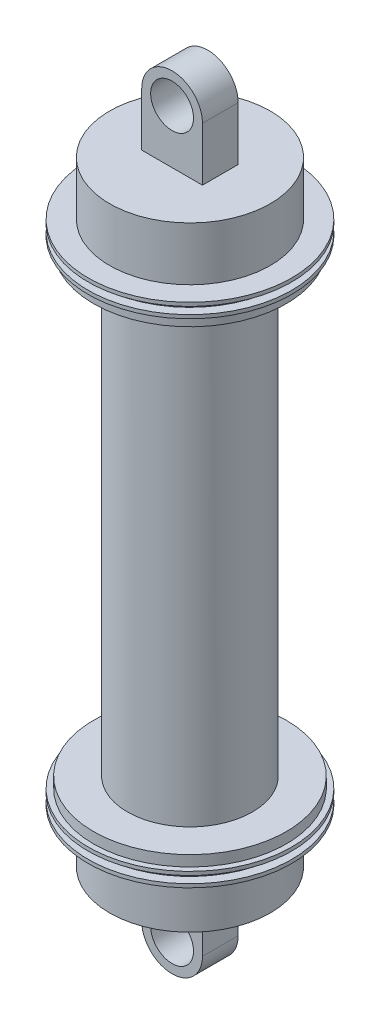
ISO-10303-21;
HEADER;
FILE_DESCRIPTION(('STEP AP214'),'2;1');
FILE_NAME('part.step','',(''),(''),'','','');
FILE_SCHEMA(('AUTOMOTIVE_DESIGN { 1 0 10303 214 1 1 1 1 }'));
ENDSEC;
DATA;
#1=APPLICATION_CONTEXT('core data for automotive mechanical design processes');
#2=APPLICATION_PROTOCOL_DEFINITION('international standard','automotive_design',2000,#1);
#3=PRODUCT_CONTEXT('',#1,'mechanical');
#4=PRODUCT('Part','Part','',(#3));
#5=PRODUCT_RELATED_PRODUCT_CATEGORY('part','',(#4));
#6=PRODUCT_DEFINITION_FORMATION('','',#4);
#7=PRODUCT_DEFINITION_CONTEXT('part definition',#1,'design');
#8=PRODUCT_DEFINITION('design','',#6,#7);
#9=PRODUCT_DEFINITION_SHAPE('','',#8);
#10=(LENGTH_UNIT() NAMED_UNIT(*) SI_UNIT(.MILLI.,.METRE.));
#11=(NAMED_UNIT(*) PLANE_ANGLE_UNIT() SI_UNIT($,.RADIAN.));
#12=(NAMED_UNIT(*) SI_UNIT($,.STERADIAN.) SOLID_ANGLE_UNIT());
#13=UNCERTAINTY_MEASURE_WITH_UNIT(LENGTH_MEASURE(1.E-05),#10,'distance_accuracy_value','');
#14=(GEOMETRIC_REPRESENTATION_CONTEXT(3) GLOBAL_UNCERTAINTY_ASSIGNED_CONTEXT((#13)) GLOBAL_UNIT_ASSIGNED_CONTEXT((#10,
#11,#12)) REPRESENTATION_CONTEXT('',''));
#15=CARTESIAN_POINT('',(0.,0.,0.));
#16=DIRECTION('',(0.,0.,1.));
#17=DIRECTION('',(1.,0.,0.));
#18=AXIS2_PLACEMENT_3D('',#15,#16,#17);
#19=CARTESIAN_POINT('',(0.,142.,0.));
#20=DIRECTION('',(0.,-1.,0.));
#21=DIRECTION('',(0.,0.,-1.));
#22=AXIS2_PLACEMENT_3D('',#19,#20,#21);
#23=CYLINDRICAL_SURFACE('',#22,17.5);
#24=CARTESIAN_POINT('',(0.,6.99999999999998,0.));
#25=DIRECTION('',(0.,1.,0.));
#26=DIRECTION('',(0.,0.,1.));
#27=AXIS2_PLACEMENT_3D('',#24,#25,#26);
#28=CIRCLE('',#27,17.5);
#29=CARTESIAN_POINT('',(0.,6.99999999999998,17.5));
#30=VERTEX_POINT('',#29);
#31=EDGE_CURVE('E222',#30,#30,#28,.T.);
#32=ORIENTED_EDGE('',*,*,#31,.T.);
#33=EDGE_LOOP('',(#32));
#34=FACE_BOUND('',#33,.T.);
#35=CARTESIAN_POINT('',(0.,135.,0.));
#36=DIRECTION('',(0.,-1.,0.));
#37=DIRECTION('',(0.,0.,-1.));
#38=AXIS2_PLACEMENT_3D('',#35,#36,#37);
#39=CIRCLE('',#38,17.5);
#40=CARTESIAN_POINT('',(0.,135.,-17.5));
#41=VERTEX_POINT('',#40);
#42=EDGE_CURVE('E224',#41,#41,#39,.T.);
#43=ORIENTED_EDGE('',*,*,#42,.T.);
#44=EDGE_LOOP('',(#43));
#45=FACE_BOUND('',#44,.T.);
#46=ADVANCED_FACE('F35',(#34,#45),#23,.T.);
#47=CARTESIAN_POINT('',(0.,135.,0.));
#48=DIRECTION('',(0.,1.,0.));
#49=DIRECTION('',(0.,0.,1.));
#50=AXIS2_PLACEMENT_3D('',#47,#48,#49);
#51=CYLINDRICAL_SURFACE('',#50,27.);
#52=CARTESIAN_POINT('',(0.,135.,0.));
#53=DIRECTION('',(0.,-1.,0.));
#54=DIRECTION('',(0.,0.,-1.));
#55=AXIS2_PLACEMENT_3D('',#52,#53,#54);
#56=CIRCLE('',#55,27.);
#57=CARTESIAN_POINT('',(0.,135.,-27.));
#58=VERTEX_POINT('',#57);
#59=EDGE_CURVE('E226',#58,#58,#56,.T.);
#60=ORIENTED_EDGE('',*,*,#59,.F.);
#61=EDGE_LOOP('',(#60));
#62=FACE_BOUND('',#61,.T.);
#63=CARTESIAN_POINT('',(0.,138.,0.));
#64=DIRECTION('',(0.,-1.,0.));
#65=DIRECTION('',(0.,0.,-1.));
#66=AXIS2_PLACEMENT_3D('',#63,#64,#65);
#67=CIRCLE('',#66,27.);
#68=CARTESIAN_POINT('',(0.,138.,-27.));
#69=VERTEX_POINT('',#68);
#70=EDGE_CURVE('E232',#69,#69,#67,.T.);
#71=ORIENTED_EDGE('',*,*,#70,.T.);
#72=EDGE_LOOP('',(#71));
#73=FACE_BOUND('',#72,.T.);
#74=ADVANCED_FACE('F203',(#62,#73),#51,.T.);
#75=CARTESIAN_POINT('',(0.,135.,0.));
#76=DIRECTION('',(0.,-1.,0.));
#77=DIRECTION('',(0.,0.,-1.));
#78=AXIS2_PLACEMENT_3D('',#75,#76,#77);
#79=PLANE('',#78);
#80=ORIENTED_EDGE('',*,*,#42,.F.);
#81=EDGE_LOOP('',(#80));
#82=FACE_BOUND('',#81,.T.);
#83=ORIENTED_EDGE('',*,*,#59,.T.);
#84=EDGE_LOOP('',(#83));
#85=FACE_BOUND('',#84,.T.);
#86=ADVANCED_FACE('F193',(#82,#85),#79,.T.);
#87=CARTESIAN_POINT('',(0.,172.,5.));
#88=DIRECTION('',(0.,0.,-1.));
#89=DIRECTION('',(-1.,0.,0.));
#90=AXIS2_PLACEMENT_3D('',#87,#88,#89);
#91=CYLINDRICAL_SURFACE('',#90,8.5);
#92=CARTESIAN_POINT('',(0.,172.,-5.));
#93=DIRECTION('',(0.,0.,-1.));
#94=DIRECTION('',(1.,0.,0.));
#95=AXIS2_PLACEMENT_3D('',#92,#93,#94);
#96=CIRCLE('',#95,8.5);
#97=CARTESIAN_POINT('',(-8.5,172.,-5.));
#98=VERTEX_POINT('',#97);
#99=CARTESIAN_POINT('',(8.5,172.,-5.));
#100=VERTEX_POINT('',#99);
#101=EDGE_CURVE('E280',#98,#100,#96,.T.);
#102=ORIENTED_EDGE('',*,*,#101,.F.);
#103=DIRECTION('',(0.,0.,-1.));
#104=VECTOR('',#103,1.);
#105=CARTESIAN_POINT('',(-8.5,172.,5.));
#106=LINE('',#105,#104);
#107=CARTESIAN_POINT('',(-8.5,172.,5.));
#108=VERTEX_POINT('',#107);
#109=EDGE_CURVE('E131',#108,#98,#106,.T.);
#110=ORIENTED_EDGE('',*,*,#109,.F.);
#111=CARTESIAN_POINT('',(0.,172.,5.));
#112=DIRECTION('',(0.,0.,-1.));
#113=DIRECTION('',(1.,0.,0.));
#114=AXIS2_PLACEMENT_3D('',#111,#112,#113);
#115=CIRCLE('',#114,8.5);
#116=CARTESIAN_POINT('',(8.5,172.,5.));
#117=VERTEX_POINT('',#116);
#118=EDGE_CURVE('E120',#108,#117,#115,.T.);
#119=ORIENTED_EDGE('',*,*,#118,.T.);
#120=DIRECTION('',(0.,0.,-1.));
#121=VECTOR('',#120,1.);
#122=CARTESIAN_POINT('',(8.5,172.,5.));
#123=LINE('',#122,#121);
#124=EDGE_CURVE('E119',#117,#100,#123,.T.);
#125=ORIENTED_EDGE('',*,*,#124,.T.);
#126=EDGE_LOOP('',(#102,#110,#119,#125));
#127=FACE_BOUND('',#126,.T.);
#128=ADVANCED_FACE('F202',(#127),#91,.T.);
#129=CARTESIAN_POINT('',(0.,172.,5.));
#130=DIRECTION('',(0.,0.,-1.));
#131=DIRECTION('',(-1.,0.,0.));
#132=AXIS2_PLACEMENT_3D('',#129,#130,#131);
#133=CYLINDRICAL_SURFACE('',#132,6.);
#134=CARTESIAN_POINT('',(0.,172.,5.));
#135=DIRECTION('',(0.,0.,-1.));
#136=DIRECTION('',(1.,0.,0.));
#137=AXIS2_PLACEMENT_3D('',#134,#135,#136);
#138=CIRCLE('',#137,6.);
#139=CARTESIAN_POINT('',(6.,172.,5.));
#140=VERTEX_POINT('',#139);
#141=EDGE_CURVE('E269',#140,#140,#138,.T.);
#142=ORIENTED_EDGE('',*,*,#141,.F.);
#143=EDGE_LOOP('',(#142));
#144=FACE_BOUND('',#143,.T.);
#145=CARTESIAN_POINT('',(0.,172.,-5.));
#146=DIRECTION('',(0.,0.,-1.));
#147=DIRECTION('',(1.,0.,0.));
#148=AXIS2_PLACEMENT_3D('',#145,#146,#147);
#149=CIRCLE('',#148,6.);
#150=CARTESIAN_POINT('',(6.,172.,-5.));
#151=VERTEX_POINT('',#150);
#152=EDGE_CURVE('E266',#151,#151,#149,.T.);
#153=ORIENTED_EDGE('',*,*,#152,.T.);
#154=EDGE_LOOP('',(#153));
#155=FACE_BOUND('',#154,.T.);
#156=ADVANCED_FACE('F209',(#144,#155),#133,.F.);
#157=CARTESIAN_POINT('',(-8.5,157.,5.));
#158=DIRECTION('',(-1.,0.,0.));
#159=DIRECTION('',(0.,-1.,0.));
#160=AXIS2_PLACEMENT_3D('',#157,#158,#159);
#161=PLANE('',#160);
#162=DIRECTION('',(0.,1.,0.));
#163=VECTOR('',#162,1.);
#164=CARTESIAN_POINT('',(-8.5,157.,-5.));
#165=LINE('',#164,#163);
#166=CARTESIAN_POINT('',(-8.5,157.,-5.));
#167=VERTEX_POINT('',#166);
#168=EDGE_CURVE('E50',#167,#98,#165,.T.);
#169=ORIENTED_EDGE('',*,*,#168,.F.);
#170=DIRECTION('',(0.,0.,-1.));
#171=VECTOR('',#170,1.);
#172=CARTESIAN_POINT('',(-8.5,157.,5.));
#173=LINE('',#172,#171);
#174=CARTESIAN_POINT('',(-8.5,157.,5.));
#175=VERTEX_POINT('',#174);
#176=EDGE_CURVE('E276',#175,#167,#173,.T.);
#177=ORIENTED_EDGE('',*,*,#176,.F.);
#178=DIRECTION('',(0.,1.,0.));
#179=VECTOR('',#178,1.);
#180=CARTESIAN_POINT('',(-8.5,157.,5.));
#181=LINE('',#180,#179);
#182=EDGE_CURVE('E109',#175,#108,#181,.T.);
#183=ORIENTED_EDGE('',*,*,#182,.T.);
#184=ORIENTED_EDGE('',*,*,#109,.T.);
#185=EDGE_LOOP('',(#169,#177,#183,#184));
#186=FACE_BOUND('',#185,.T.);
#187=ADVANCED_FACE('F285',(#186),#161,.T.);
#188=CARTESIAN_POINT('',(0.,172.,5.));
#189=DIRECTION('',(0.,0.,1.));
#190=DIRECTION('',(1.,0.,0.));
#191=AXIS2_PLACEMENT_3D('',#188,#189,#190);
#192=PLANE('',#191);
#193=ORIENTED_EDGE('',*,*,#141,.T.);
#194=EDGE_LOOP('',(#193));
#195=FACE_BOUND('',#194,.T.);
#196=DIRECTION('',(-1.,0.,0.));
#197=VECTOR('',#196,1.);
#198=CARTESIAN_POINT('',(-8.5,157.,5.));
#199=LINE('',#198,#197);
#200=CARTESIAN_POINT('',(8.5,157.,5.));
#201=VERTEX_POINT('',#200);
#202=EDGE_CURVE('E102',#201,#175,#199,.T.);
#203=ORIENTED_EDGE('',*,*,#202,.F.);
#204=DIRECTION('',(0.,-1.,0.));
#205=VECTOR('',#204,1.);
#206=CARTESIAN_POINT('',(8.5,172.,5.));
#207=LINE('',#206,#205);
#208=EDGE_CURVE('E106',#117,#201,#207,.T.);
#209=ORIENTED_EDGE('',*,*,#208,.F.);
#210=ORIENTED_EDGE('',*,*,#118,.F.);
#211=ORIENTED_EDGE('',*,*,#182,.F.);
#212=EDGE_LOOP('',(#203,#209,#210,#211));
#213=FACE_BOUND('',#212,.T.);
#214=ADVANCED_FACE('F104',(#195,#213),#192,.T.);
#215=CARTESIAN_POINT('',(8.5,172.,5.));
#216=DIRECTION('',(1.,0.,0.));
#217=DIRECTION('',(0.,0.,-1.));
#218=AXIS2_PLACEMENT_3D('',#215,#216,#217);
#219=PLANE('',#218);
#220=DIRECTION('',(0.,-1.,0.));
#221=VECTOR('',#220,1.);
#222=CARTESIAN_POINT('',(8.5,172.,-5.));
#223=LINE('',#222,#221);
#224=CARTESIAN_POINT('',(8.5,157.,-5.));
#225=VERTEX_POINT('',#224);
#226=EDGE_CURVE('E278',#100,#225,#223,.T.);
#227=ORIENTED_EDGE('',*,*,#226,.F.);
#228=ORIENTED_EDGE('',*,*,#124,.F.);
#229=ORIENTED_EDGE('',*,*,#208,.T.);
#230=DIRECTION('',(0.,0.,-1.));
#231=VECTOR('',#230,1.);
#232=CARTESIAN_POINT('',(8.5,157.,5.));
#233=LINE('',#232,#231);
#234=EDGE_CURVE('E117',#201,#225,#233,.T.);
#235=ORIENTED_EDGE('',*,*,#234,.T.);
#236=EDGE_LOOP('',(#227,#228,#229,#235));
#237=FACE_BOUND('',#236,.T.);
#238=ADVANCED_FACE('F116',(#237),#219,.T.);
#239=CARTESIAN_POINT('',(0.,172.,-5.));
#240=DIRECTION('',(0.,0.,1.));
#241=DIRECTION('',(1.,0.,0.));
#242=AXIS2_PLACEMENT_3D('',#239,#240,#241);
#243=PLANE('',#242);
#244=ORIENTED_EDGE('',*,*,#152,.F.);
#245=EDGE_LOOP('',(#244));
#246=FACE_BOUND('',#245,.T.);
#247=DIRECTION('',(-1.,0.,0.));
#248=VECTOR('',#247,1.);
#249=CARTESIAN_POINT('',(-8.5,157.,-5.));
#250=LINE('',#249,#248);
#251=EDGE_CURVE('E125',#225,#167,#250,.T.);
#252=ORIENTED_EDGE('',*,*,#251,.T.);
#253=ORIENTED_EDGE('',*,*,#168,.T.);
#254=ORIENTED_EDGE('',*,*,#101,.T.);
#255=ORIENTED_EDGE('',*,*,#226,.T.);
#256=EDGE_LOOP('',(#252,#253,#254,#255));
#257=FACE_BOUND('',#256,.T.);
#258=ADVANCED_FACE('F287',(#246,#257),#243,.F.);
#259=CARTESIAN_POINT('',(0.,157.,0.));
#260=DIRECTION('',(0.,1.,0.));
#261=DIRECTION('',(0.,0.,-1.));
#262=AXIS2_PLACEMENT_3D('',#259,#260,#261);
#263=PLANE('',#262);
#264=ORIENTED_EDGE('',*,*,#251,.F.);
#265=ORIENTED_EDGE('',*,*,#234,.F.);
#266=ORIENTED_EDGE('',*,*,#202,.T.);
#267=ORIENTED_EDGE('',*,*,#176,.T.);
#268=EDGE_LOOP('',(#264,#265,#266,#267));
#269=FACE_BOUND('',#268,.T.);
#270=CARTESIAN_POINT('',(0.,157.,0.));
#271=DIRECTION('',(0.,-1.,0.));
#272=DIRECTION('',(0.,0.,-1.));
#273=AXIS2_PLACEMENT_3D('',#270,#271,#272);
#274=CIRCLE('',#273,22.5);
#275=CARTESIAN_POINT('',(0.,157.,-22.5));
#276=VERTEX_POINT('',#275);
#277=EDGE_CURVE('E129',#276,#276,#274,.T.);
#278=ORIENTED_EDGE('',*,*,#277,.F.);
#279=EDGE_LOOP('',(#278));
#280=FACE_BOUND('',#279,.T.);
#281=ADVANCED_FACE('F123',(#269,#280),#263,.T.);
#282=CARTESIAN_POINT('',(0.,157.,0.));
#283=DIRECTION('',(0.,-1.,0.));
#284=DIRECTION('',(0.,0.,-1.));
#285=AXIS2_PLACEMENT_3D('',#282,#283,#284);
#286=CYLINDRICAL_SURFACE('',#285,22.5);
#287=ORIENTED_EDGE('',*,*,#277,.T.);
#288=EDGE_LOOP('',(#287));
#289=FACE_BOUND('',#288,.T.);
#290=CARTESIAN_POINT('',(0.,142.,0.));
#291=DIRECTION('',(0.,-1.,0.));
#292=DIRECTION('',(0.,0.,-1.));
#293=AXIS2_PLACEMENT_3D('',#290,#291,#292);
#294=CIRCLE('',#293,22.5);
#295=CARTESIAN_POINT('',(0.,142.,-22.5));
#296=VERTEX_POINT('',#295);
#297=EDGE_CURVE('E126',#296,#296,#294,.T.);
#298=ORIENTED_EDGE('',*,*,#297,.F.);
#299=EDGE_LOOP('',(#298));
#300=FACE_BOUND('',#299,.T.);
#301=ADVANCED_FACE('F295',(#289,#300),#286,.T.);
#302=CARTESIAN_POINT('',(0.,142.,0.));
#303=DIRECTION('',(0.,-1.,0.));
#304=DIRECTION('',(0.,0.,-1.));
#305=AXIS2_PLACEMENT_3D('',#302,#303,#304);
#306=PLANE('',#305);
#307=CARTESIAN_POINT('',(0.,142.,0.));
#308=DIRECTION('',(0.,-1.,0.));
#309=DIRECTION('',(0.,0.,-1.));
#310=AXIS2_PLACEMENT_3D('',#307,#308,#309);
#311=CIRCLE('',#310,28.5);
#312=CARTESIAN_POINT('',(0.,142.,-28.5));
#313=VERTEX_POINT('',#312);
#314=EDGE_CURVE('E260',#313,#313,#311,.T.);
#315=ORIENTED_EDGE('',*,*,#314,.F.);
#316=EDGE_LOOP('',(#315));
#317=FACE_BOUND('',#316,.T.);
#318=ORIENTED_EDGE('',*,*,#297,.T.);
#319=EDGE_LOOP('',(#318));
#320=FACE_BOUND('',#319,.T.);
#321=ADVANCED_FACE('F306',(#317,#320),#306,.F.);
#322=CARTESIAN_POINT('',(0.,141.,0.));
#323=DIRECTION('',(0.,1.,0.));
#324=DIRECTION('',(0.,0.,1.));
#325=AXIS2_PLACEMENT_3D('',#322,#323,#324);
#326=CYLINDRICAL_SURFACE('',#325,28.5);
#327=CARTESIAN_POINT('',(0.,141.,0.));
#328=DIRECTION('',(0.,-1.,0.));
#329=DIRECTION('',(0.,0.,-1.));
#330=AXIS2_PLACEMENT_3D('',#327,#328,#329);
#331=CIRCLE('',#330,28.5);
#332=CARTESIAN_POINT('',(0.,141.,-28.5));
#333=VERTEX_POINT('',#332);
#334=EDGE_CURVE('E263',#333,#333,#331,.T.);
#335=ORIENTED_EDGE('',*,*,#334,.F.);
#336=EDGE_LOOP('',(#335));
#337=FACE_BOUND('',#336,.T.);
#338=ORIENTED_EDGE('',*,*,#314,.T.);
#339=EDGE_LOOP('',(#338));
#340=FACE_BOUND('',#339,.T.);
#341=ADVANCED_FACE('F382',(#337,#340),#326,.T.);
#342=CARTESIAN_POINT('',(0.,141.,0.));
#343=DIRECTION('',(0.,-1.,0.));
#344=DIRECTION('',(0.,0.,-1.));
#345=AXIS2_PLACEMENT_3D('',#342,#343,#344);
#346=PLANE('',#345);
#347=CARTESIAN_POINT('',(0.,141.,0.));
#348=DIRECTION('',(0.,-1.,0.));
#349=DIRECTION('',(0.,0.,-1.));
#350=AXIS2_PLACEMENT_3D('',#347,#348,#349);
#351=CIRCLE('',#350,26.);
#352=CARTESIAN_POINT('',(0.,141.,-26.));
#353=VERTEX_POINT('',#352);
#354=EDGE_CURVE('E254',#353,#353,#351,.T.);
#355=ORIENTED_EDGE('',*,*,#354,.F.);
#356=EDGE_LOOP('',(#355));
#357=FACE_BOUND('',#356,.T.);
#358=ORIENTED_EDGE('',*,*,#334,.T.);
#359=EDGE_LOOP('',(#358));
#360=FACE_BOUND('',#359,.T.);
#361=ADVANCED_FACE('F378',(#357,#360),#346,.T.);
#362=CARTESIAN_POINT('',(0.,139.,0.));
#363=DIRECTION('',(0.,1.,0.));
#364=DIRECTION('',(0.,0.,1.));
#365=AXIS2_PLACEMENT_3D('',#362,#363,#364);
#366=CYLINDRICAL_SURFACE('',#365,26.);
#367=CARTESIAN_POINT('',(0.,139.,0.));
#368=DIRECTION('',(0.,-1.,0.));
#369=DIRECTION('',(0.,0.,-1.));
#370=AXIS2_PLACEMENT_3D('',#367,#368,#369);
#371=CIRCLE('',#370,26.);
#372=CARTESIAN_POINT('',(0.,139.,-26.));
#373=VERTEX_POINT('',#372);
#374=EDGE_CURVE('E257',#373,#373,#371,.T.);
#375=ORIENTED_EDGE('',*,*,#374,.F.);
#376=EDGE_LOOP('',(#375));
#377=FACE_BOUND('',#376,.T.);
#378=ORIENTED_EDGE('',*,*,#354,.T.);
#379=EDGE_LOOP('',(#378));
#380=FACE_BOUND('',#379,.T.);
#381=ADVANCED_FACE('F371',(#377,#380),#366,.T.);
#382=CARTESIAN_POINT('',(0.,139.,0.));
#383=DIRECTION('',(0.,-1.,0.));
#384=DIRECTION('',(0.,0.,-1.));
#385=AXIS2_PLACEMENT_3D('',#382,#383,#384);
#386=PLANE('',#385);
#387=ORIENTED_EDGE('',*,*,#374,.T.);
#388=EDGE_LOOP('',(#387));
#389=FACE_BOUND('',#388,.T.);
#390=CARTESIAN_POINT('',(0.,139.,0.));
#391=DIRECTION('',(0.,-1.,0.));
#392=DIRECTION('',(0.,0.,-1.));
#393=AXIS2_PLACEMENT_3D('',#390,#391,#392);
#394=CIRCLE('',#393,28.5);
#395=CARTESIAN_POINT('',(0.,139.,-28.5));
#396=VERTEX_POINT('',#395);
#397=EDGE_CURVE('E250',#396,#396,#394,.T.);
#398=ORIENTED_EDGE('',*,*,#397,.F.);
#399=EDGE_LOOP('',(#398));
#400=FACE_BOUND('',#399,.T.);
#401=ADVANCED_FACE('F368',(#389,#400),#386,.F.);
#402=CARTESIAN_POINT('',(0.,138.,0.));
#403=DIRECTION('',(0.,1.,0.));
#404=DIRECTION('',(0.,0.,1.));
#405=AXIS2_PLACEMENT_3D('',#402,#403,#404);
#406=CYLINDRICAL_SURFACE('',#405,28.5);
#407=CARTESIAN_POINT('',(0.,138.,0.));
#408=DIRECTION('',(0.,-1.,0.));
#409=DIRECTION('',(0.,0.,-1.));
#410=AXIS2_PLACEMENT_3D('',#407,#408,#409);
#411=CIRCLE('',#410,28.5);
#412=CARTESIAN_POINT('',(0.,138.,-28.5));
#413=VERTEX_POINT('',#412);
#414=EDGE_CURVE('E251',#413,#413,#411,.T.);
#415=ORIENTED_EDGE('',*,*,#414,.F.);
#416=EDGE_LOOP('',(#415));
#417=FACE_BOUND('',#416,.T.);
#418=ORIENTED_EDGE('',*,*,#397,.T.);
#419=EDGE_LOOP('',(#418));
#420=FACE_BOUND('',#419,.T.);
#421=ADVANCED_FACE('F366',(#417,#420),#406,.T.);
#422=CARTESIAN_POINT('',(0.,138.,0.));
#423=DIRECTION('',(0.,-1.,0.));
#424=DIRECTION('',(0.,0.,-1.));
#425=AXIS2_PLACEMENT_3D('',#422,#423,#424);
#426=PLANE('',#425);
#427=ORIENTED_EDGE('',*,*,#70,.F.);
#428=EDGE_LOOP('',(#427));
#429=FACE_BOUND('',#428,.T.);
#430=ORIENTED_EDGE('',*,*,#414,.T.);
#431=EDGE_LOOP('',(#430));
#432=FACE_BOUND('',#431,.T.);
#433=ADVANCED_FACE('F362',(#429,#432),#426,.T.);
#434=CARTESIAN_POINT('',(0.,6.99999999999998,0.));
#435=DIRECTION('',(0.,-1.,0.));
#436=DIRECTION('',(0.,0.,-1.));
#437=AXIS2_PLACEMENT_3D('',#434,#435,#436);
#438=CYLINDRICAL_SURFACE('',#437,27.);
#439=CARTESIAN_POINT('',(0.,6.99999999999998,0.));
#440=DIRECTION('',(0.,-1.,0.));
#441=DIRECTION('',(0.,0.,-1.));
#442=AXIS2_PLACEMENT_3D('',#439,#440,#441);
#443=CIRCLE('',#442,27.);
#444=CARTESIAN_POINT('',(0.,6.99999999999998,-27.));
#445=VERTEX_POINT('',#444);
#446=EDGE_CURVE('E666',#445,#445,#443,.T.);
#447=ORIENTED_EDGE('',*,*,#446,.T.);
#448=EDGE_LOOP('',(#447));
#449=FACE_BOUND('',#448,.T.);
#450=CARTESIAN_POINT('',(0.,3.99999999999998,0.));
#451=DIRECTION('',(0.,1.,0.));
#452=DIRECTION('',(0.,0.,1.));
#453=AXIS2_PLACEMENT_3D('',#450,#451,#452);
#454=CIRCLE('',#453,27.);
#455=CARTESIAN_POINT('',(0.,3.99999999999998,27.));
#456=VERTEX_POINT('',#455);
#457=EDGE_CURVE('E11',#456,#456,#454,.T.);
#458=ORIENTED_EDGE('',*,*,#457,.T.);
#459=EDGE_LOOP('',(#458));
#460=FACE_BOUND('',#459,.T.);
#461=ADVANCED_FACE('F365',(#449,#460),#438,.T.);
#462=CARTESIAN_POINT('',(0.,6.99999999999998,0.));
#463=DIRECTION('',(0.,1.,0.));
#464=DIRECTION('',(0.,0.,-1.));
#465=AXIS2_PLACEMENT_3D('',#462,#463,#464);
#466=PLANE('',#465);
#467=ORIENTED_EDGE('',*,*,#31,.F.);
#468=EDGE_LOOP('',(#467));
#469=FACE_BOUND('',#468,.T.);
#470=ORIENTED_EDGE('',*,*,#446,.F.);
#471=EDGE_LOOP('',(#470));
#472=FACE_BOUND('',#471,.T.);
#473=ADVANCED_FACE('F198',(#469,#472),#466,.T.);
#474=CARTESIAN_POINT('',(0.,-30.,5.));
#475=DIRECTION('',(0.,0.,-1.));
#476=DIRECTION('',(-1.,0.,0.));
#477=AXIS2_PLACEMENT_3D('',#474,#475,#476);
#478=CYLINDRICAL_SURFACE('',#477,6.);
#479=CARTESIAN_POINT('',(0.,-30.,5.));
#480=DIRECTION('',(0.,0.,1.));
#481=DIRECTION('',(1.,0.,0.));
#482=AXIS2_PLACEMENT_3D('',#479,#480,#481);
#483=CIRCLE('',#482,6.);
#484=CARTESIAN_POINT('',(6.,-30.,5.));
#485=VERTEX_POINT('',#484);
#486=EDGE_CURVE('E138',#485,#485,#483,.T.);
#487=ORIENTED_EDGE('',*,*,#486,.T.);
#488=EDGE_LOOP('',(#487));
#489=FACE_BOUND('',#488,.T.);
#490=CARTESIAN_POINT('',(0.,-30.,-5.));
#491=DIRECTION('',(0.,0.,1.));
#492=DIRECTION('',(1.,0.,0.));
#493=AXIS2_PLACEMENT_3D('',#490,#491,#492);
#494=CIRCLE('',#493,6.);
#495=CARTESIAN_POINT('',(6.,-30.,-5.));
#496=VERTEX_POINT('',#495);
#497=EDGE_CURVE('E136',#496,#496,#494,.T.);
#498=ORIENTED_EDGE('',*,*,#497,.F.);
#499=EDGE_LOOP('',(#498));
#500=FACE_BOUND('',#499,.T.);
#501=ADVANCED_FACE('F308',(#489,#500),#478,.F.);
#502=CARTESIAN_POINT('',(0.,-30.,5.));
#503=DIRECTION('',(0.,0.,-1.));
#504=DIRECTION('',(-1.,0.,0.));
#505=AXIS2_PLACEMENT_3D('',#502,#503,#504);
#506=CYLINDRICAL_SURFACE('',#505,8.5);
#507=CARTESIAN_POINT('',(0.,-30.,-5.));
#508=DIRECTION('',(0.,0.,1.));
#509=DIRECTION('',(1.,0.,0.));
#510=AXIS2_PLACEMENT_3D('',#507,#508,#509);
#511=CIRCLE('',#510,8.5);
#512=CARTESIAN_POINT('',(-8.5,-30.,-5.));
#513=VERTEX_POINT('',#512);
#514=CARTESIAN_POINT('',(8.5,-30.,-5.));
#515=VERTEX_POINT('',#514);
#516=EDGE_CURVE('E157',#513,#515,#511,.T.);
#517=ORIENTED_EDGE('',*,*,#516,.T.);
#518=DIRECTION('',(0.,0.,-1.));
#519=VECTOR('',#518,1.);
#520=CARTESIAN_POINT('',(8.5,-30.,5.));
#521=LINE('',#520,#519);
#522=CARTESIAN_POINT('',(8.5,-30.,5.));
#523=VERTEX_POINT('',#522);
#524=EDGE_CURVE('E162',#523,#515,#521,.T.);
#525=ORIENTED_EDGE('',*,*,#524,.F.);
#526=CARTESIAN_POINT('',(0.,-30.,5.));
#527=DIRECTION('',(0.,0.,1.));
#528=DIRECTION('',(1.,0.,0.));
#529=AXIS2_PLACEMENT_3D('',#526,#527,#528);
#530=CIRCLE('',#529,8.5);
#531=CARTESIAN_POINT('',(-8.5,-30.,5.));
#532=VERTEX_POINT('',#531);
#533=EDGE_CURVE('E149',#532,#523,#530,.T.);
#534=ORIENTED_EDGE('',*,*,#533,.F.);
#535=DIRECTION('',(0.,0.,-1.));
#536=VECTOR('',#535,1.);
#537=CARTESIAN_POINT('',(-8.5,-30.,5.));
#538=LINE('',#537,#536);
#539=EDGE_CURVE('E165',#532,#513,#538,.T.);
#540=ORIENTED_EDGE('',*,*,#539,.T.);
#541=EDGE_LOOP('',(#517,#525,#534,#540));
#542=FACE_BOUND('',#541,.T.);
#543=ADVANCED_FACE('F311',(#542),#506,.T.);
#544=CARTESIAN_POINT('',(0.,-30.,5.));
#545=DIRECTION('',(0.,0.,1.));
#546=DIRECTION('',(1.,0.,0.));
#547=AXIS2_PLACEMENT_3D('',#544,#545,#546);
#548=PLANE('',#547);
#549=DIRECTION('',(-1.,0.,0.));
#550=VECTOR('',#549,1.);
#551=CARTESIAN_POINT('',(-8.5,-15.,5.));
#552=LINE('',#551,#550);
#553=CARTESIAN_POINT('',(8.5,-15.,5.));
#554=VERTEX_POINT('',#553);
#555=CARTESIAN_POINT('',(-8.5,-15.,5.));
#556=VERTEX_POINT('',#555);
#557=EDGE_CURVE('E143',#554,#556,#552,.T.);
#558=ORIENTED_EDGE('',*,*,#557,.T.);
#559=DIRECTION('',(0.,-1.,0.));
#560=VECTOR('',#559,1.);
#561=CARTESIAN_POINT('',(-8.5,-15.,5.));
#562=LINE('',#561,#560);
#563=EDGE_CURVE('E146',#556,#532,#562,.T.);
#564=ORIENTED_EDGE('',*,*,#563,.T.);
#565=ORIENTED_EDGE('',*,*,#533,.T.);
#566=DIRECTION('',(0.,1.,0.));
#567=VECTOR('',#566,1.);
#568=CARTESIAN_POINT('',(8.5,-30.,5.));
#569=LINE('',#568,#567);
#570=EDGE_CURVE('E151',#523,#554,#569,.T.);
#571=ORIENTED_EDGE('',*,*,#570,.T.);
#572=EDGE_LOOP('',(#558,#564,#565,#571));
#573=FACE_BOUND('',#572,.T.);
#574=ORIENTED_EDGE('',*,*,#486,.F.);
#575=EDGE_LOOP('',(#574));
#576=FACE_BOUND('',#575,.T.);
#577=ADVANCED_FACE('F313',(#573,#576),#548,.T.);
#578=CARTESIAN_POINT('',(-8.5,-15.,5.));
#579=DIRECTION('',(1.,0.,0.));
#580=DIRECTION('',(0.,1.,0.));
#581=AXIS2_PLACEMENT_3D('',#578,#579,#580);
#582=PLANE('',#581);
#583=DIRECTION('',(0.,-1.,0.));
#584=VECTOR('',#583,1.);
#585=CARTESIAN_POINT('',(-8.5,-15.,-5.));
#586=LINE('',#585,#584);
#587=CARTESIAN_POINT('',(-8.5,-15.,-5.));
#588=VERTEX_POINT('',#587);
#589=EDGE_CURVE('E155',#588,#513,#586,.T.);
#590=ORIENTED_EDGE('',*,*,#589,.T.);
#591=ORIENTED_EDGE('',*,*,#539,.F.);
#592=ORIENTED_EDGE('',*,*,#563,.F.);
#593=DIRECTION('',(0.,0.,-1.));
#594=VECTOR('',#593,1.);
#595=CARTESIAN_POINT('',(-8.5,-15.,5.));
#596=LINE('',#595,#594);
#597=EDGE_CURVE('E168',#556,#588,#596,.T.);
#598=ORIENTED_EDGE('',*,*,#597,.T.);
#599=EDGE_LOOP('',(#590,#591,#592,#598));
#600=FACE_BOUND('',#599,.T.);
#601=ADVANCED_FACE('F316',(#600),#582,.F.);
#602=CARTESIAN_POINT('',(0.,-30.,-5.));
#603=DIRECTION('',(0.,0.,1.));
#604=DIRECTION('',(1.,0.,0.));
#605=AXIS2_PLACEMENT_3D('',#602,#603,#604);
#606=PLANE('',#605);
#607=DIRECTION('',(-1.,0.,0.));
#608=VECTOR('',#607,1.);
#609=CARTESIAN_POINT('',(-8.5,-15.,-5.));
#610=LINE('',#609,#608);
#611=CARTESIAN_POINT('',(8.5,-15.,-5.));
#612=VERTEX_POINT('',#611);
#613=EDGE_CURVE('E58',#612,#588,#610,.T.);
#614=ORIENTED_EDGE('',*,*,#613,.F.);
#615=DIRECTION('',(0.,1.,0.));
#616=VECTOR('',#615,1.);
#617=CARTESIAN_POINT('',(8.5,-30.,-5.));
#618=LINE('',#617,#616);
#619=EDGE_CURVE('E147',#515,#612,#618,.T.);
#620=ORIENTED_EDGE('',*,*,#619,.F.);
#621=ORIENTED_EDGE('',*,*,#516,.F.);
#622=ORIENTED_EDGE('',*,*,#589,.F.);
#623=EDGE_LOOP('',(#614,#620,#621,#622));
#624=FACE_BOUND('',#623,.T.);
#625=ORIENTED_EDGE('',*,*,#497,.T.);
#626=EDGE_LOOP('',(#625));
#627=FACE_BOUND('',#626,.T.);
#628=ADVANCED_FACE('F318',(#624,#627),#606,.F.);
#629=CARTESIAN_POINT('',(8.5,-30.,5.));
#630=DIRECTION('',(-1.,0.,0.));
#631=DIRECTION('',(0.,0.,1.));
#632=AXIS2_PLACEMENT_3D('',#629,#630,#631);
#633=PLANE('',#632);
#634=ORIENTED_EDGE('',*,*,#619,.T.);
#635=DIRECTION('',(0.,0.,-1.));
#636=VECTOR('',#635,1.);
#637=CARTESIAN_POINT('',(8.5,-15.,5.));
#638=LINE('',#637,#636);
#639=EDGE_CURVE('E153',#554,#612,#638,.T.);
#640=ORIENTED_EDGE('',*,*,#639,.F.);
#641=ORIENTED_EDGE('',*,*,#570,.F.);
#642=ORIENTED_EDGE('',*,*,#524,.T.);
#643=EDGE_LOOP('',(#634,#640,#641,#642));
#644=FACE_BOUND('',#643,.T.);
#645=ADVANCED_FACE('F321',(#644),#633,.F.);
#646=CARTESIAN_POINT('',(0.,-15.,0.));
#647=DIRECTION('',(0.,-1.,0.));
#648=DIRECTION('',(0.,0.,-1.));
#649=AXIS2_PLACEMENT_3D('',#646,#647,#648);
#650=PLANE('',#649);
#651=CARTESIAN_POINT('',(0.,-15.,0.));
#652=DIRECTION('',(0.,-1.,0.));
#653=DIRECTION('',(0.,0.,-1.));
#654=AXIS2_PLACEMENT_3D('',#651,#652,#653);
#655=CIRCLE('',#654,22.5);
#656=CARTESIAN_POINT('',(0.,-15.,-22.5));
#657=VERTEX_POINT('',#656);
#658=EDGE_CURVE('E171',#657,#657,#655,.T.);
#659=ORIENTED_EDGE('',*,*,#658,.T.);
#660=EDGE_LOOP('',(#659));
#661=FACE_BOUND('',#660,.T.);
#662=ORIENTED_EDGE('',*,*,#639,.T.);
#663=ORIENTED_EDGE('',*,*,#613,.T.);
#664=ORIENTED_EDGE('',*,*,#597,.F.);
#665=ORIENTED_EDGE('',*,*,#557,.F.);
#666=EDGE_LOOP('',(#662,#663,#664,#665));
#667=FACE_BOUND('',#666,.T.);
#668=ADVANCED_FACE('F324',(#661,#667),#650,.T.);
#669=CARTESIAN_POINT('',(0.,-15.,0.));
#670=DIRECTION('',(0.,1.,0.));
#671=DIRECTION('',(0.,0.,1.));
#672=AXIS2_PLACEMENT_3D('',#669,#670,#671);
#673=CYLINDRICAL_SURFACE('',#672,22.5);
#674=ORIENTED_EDGE('',*,*,#658,.F.);
#675=EDGE_LOOP('',(#674));
#676=FACE_BOUND('',#675,.T.);
#677=CARTESIAN_POINT('',(0.,0.,0.));
#678=DIRECTION('',(0.,1.,0.));
#679=DIRECTION('',(0.,0.,1.));
#680=AXIS2_PLACEMENT_3D('',#677,#678,#679);
#681=CIRCLE('',#680,22.5);
#682=CARTESIAN_POINT('',(0.,0.,22.5));
#683=VERTEX_POINT('',#682);
#684=EDGE_CURVE('E245',#683,#683,#681,.T.);
#685=ORIENTED_EDGE('',*,*,#684,.F.);
#686=EDGE_LOOP('',(#685));
#687=FACE_BOUND('',#686,.T.);
#688=ADVANCED_FACE('F334',(#676,#687),#673,.T.);
#689=CARTESIAN_POINT('',(0.,0.,0.));
#690=DIRECTION('',(0.,1.,0.));
#691=DIRECTION('',(0.,0.,-1.));
#692=AXIS2_PLACEMENT_3D('',#689,#690,#691);
#693=PLANE('',#692);
#694=ORIENTED_EDGE('',*,*,#684,.T.);
#695=EDGE_LOOP('',(#694));
#696=FACE_BOUND('',#695,.T.);
#697=CARTESIAN_POINT('',(0.,0.,0.));
#698=DIRECTION('',(0.,-1.,0.));
#699=DIRECTION('',(0.,0.,-1.));
#700=AXIS2_PLACEMENT_3D('',#697,#698,#699);
#701=CIRCLE('',#700,28.5);
#702=CARTESIAN_POINT('',(0.,0.,-28.5));
#703=VERTEX_POINT('',#702);
#704=EDGE_CURVE('E241',#703,#703,#701,.T.);
#705=ORIENTED_EDGE('',*,*,#704,.T.);
#706=EDGE_LOOP('',(#705));
#707=FACE_BOUND('',#706,.T.);
#708=ADVANCED_FACE('F337',(#696,#707),#693,.F.);
#709=CARTESIAN_POINT('',(0.,0.999999999999972,0.));
#710=DIRECTION('',(0.,-1.,0.));
#711=DIRECTION('',(0.,0.,-1.));
#712=AXIS2_PLACEMENT_3D('',#709,#710,#711);
#713=CYLINDRICAL_SURFACE('',#712,28.5);
#714=CARTESIAN_POINT('',(0.,0.999999999999972,0.));
#715=DIRECTION('',(0.,-1.,0.));
#716=DIRECTION('',(0.,0.,-1.));
#717=AXIS2_PLACEMENT_3D('',#714,#715,#716);
#718=CIRCLE('',#717,28.5);
#719=CARTESIAN_POINT('',(0.,0.999999999999972,-28.5));
#720=VERTEX_POINT('',#719);
#721=EDGE_CURVE('E242',#720,#720,#718,.T.);
#722=ORIENTED_EDGE('',*,*,#721,.T.);
#723=EDGE_LOOP('',(#722));
#724=FACE_BOUND('',#723,.T.);
#725=ORIENTED_EDGE('',*,*,#704,.F.);
#726=EDGE_LOOP('',(#725));
#727=FACE_BOUND('',#726,.T.);
#728=ADVANCED_FACE('F342',(#724,#727),#713,.T.);
#729=CARTESIAN_POINT('',(0.,0.999999999999972,0.));
#730=DIRECTION('',(0.,1.,0.));
#731=DIRECTION('',(0.,0.,-1.));
#732=AXIS2_PLACEMENT_3D('',#729,#730,#731);
#733=PLANE('',#732);
#734=CARTESIAN_POINT('',(0.,0.999999999999972,0.));
#735=DIRECTION('',(0.,1.,0.));
#736=DIRECTION('',(0.,0.,1.));
#737=AXIS2_PLACEMENT_3D('',#734,#735,#736);
#738=CIRCLE('',#737,26.);
#739=CARTESIAN_POINT('',(0.,0.999999999999972,26.));
#740=VERTEX_POINT('',#739);
#741=EDGE_CURVE('E174',#740,#740,#738,.T.);
#742=ORIENTED_EDGE('',*,*,#741,.F.);
#743=EDGE_LOOP('',(#742));
#744=FACE_BOUND('',#743,.T.);
#745=ORIENTED_EDGE('',*,*,#721,.F.);
#746=EDGE_LOOP('',(#745));
#747=FACE_BOUND('',#746,.T.);
#748=ADVANCED_FACE('F352',(#744,#747),#733,.T.);
#749=CARTESIAN_POINT('',(0.,2.99999999999997,0.));
#750=DIRECTION('',(0.,-1.,0.));
#751=DIRECTION('',(0.,0.,-1.));
#752=AXIS2_PLACEMENT_3D('',#749,#750,#751);
#753=CYLINDRICAL_SURFACE('',#752,26.);
#754=CARTESIAN_POINT('',(0.,2.99999999999998,0.));
#755=DIRECTION('',(0.,1.,0.));
#756=DIRECTION('',(0.,0.,1.));
#757=AXIS2_PLACEMENT_3D('',#754,#755,#756);
#758=CIRCLE('',#757,26.);
#759=CARTESIAN_POINT('',(0.,2.99999999999998,26.));
#760=VERTEX_POINT('',#759);
#761=EDGE_CURVE('E237',#760,#760,#758,.F.);
#762=ORIENTED_EDGE('',*,*,#761,.T.);
#763=EDGE_LOOP('',(#762));
#764=FACE_BOUND('',#763,.T.);
#765=ORIENTED_EDGE('',*,*,#741,.T.);
#766=EDGE_LOOP('',(#765));
#767=FACE_BOUND('',#766,.T.);
#768=ADVANCED_FACE('F358',(#764,#767),#753,.T.);
#769=CARTESIAN_POINT('',(0.,2.99999999999998,0.));
#770=DIRECTION('',(0.,1.,0.));
#771=DIRECTION('',(0.,0.,-1.));
#772=AXIS2_PLACEMENT_3D('',#769,#770,#771);
#773=PLANE('',#772);
#774=CARTESIAN_POINT('',(0.,2.99999999999998,0.));
#775=DIRECTION('',(0.,-1.,0.));
#776=DIRECTION('',(0.,0.,-1.));
#777=AXIS2_PLACEMENT_3D('',#774,#775,#776);
#778=CIRCLE('',#777,28.5);
#779=CARTESIAN_POINT('',(0.,2.99999999999998,-28.5));
#780=VERTEX_POINT('',#779);
#781=EDGE_CURVE('E225',#780,#780,#778,.T.);
#782=ORIENTED_EDGE('',*,*,#781,.T.);
#783=EDGE_LOOP('',(#782));
#784=FACE_BOUND('',#783,.T.);
#785=ORIENTED_EDGE('',*,*,#761,.F.);
#786=EDGE_LOOP('',(#785));
#787=FACE_BOUND('',#786,.T.);
#788=ADVANCED_FACE('F439',(#784,#787),#773,.F.);
#789=CARTESIAN_POINT('',(0.,3.99999999999998,0.));
#790=DIRECTION('',(0.,-1.,0.));
#791=DIRECTION('',(0.,0.,-1.));
#792=AXIS2_PLACEMENT_3D('',#789,#790,#791);
#793=CYLINDRICAL_SURFACE('',#792,28.5);
#794=CARTESIAN_POINT('',(0.,3.99999999999998,0.));
#795=DIRECTION('',(0.,-1.,0.));
#796=DIRECTION('',(0.,0.,-1.));
#797=AXIS2_PLACEMENT_3D('',#794,#795,#796);
#798=CIRCLE('',#797,28.5);
#799=CARTESIAN_POINT('',(0.,3.99999999999998,-28.5));
#800=VERTEX_POINT('',#799);
#801=EDGE_CURVE('E229',#800,#800,#798,.T.);
#802=ORIENTED_EDGE('',*,*,#801,.T.);
#803=EDGE_LOOP('',(#802));
#804=FACE_BOUND('',#803,.T.);
#805=ORIENTED_EDGE('',*,*,#781,.F.);
#806=EDGE_LOOP('',(#805));
#807=FACE_BOUND('',#806,.T.);
#808=ADVANCED_FACE('F433',(#804,#807),#793,.T.);
#809=CARTESIAN_POINT('',(0.,3.99999999999998,0.));
#810=DIRECTION('',(0.,1.,0.));
#811=DIRECTION('',(0.,0.,-1.));
#812=AXIS2_PLACEMENT_3D('',#809,#810,#811);
#813=PLANE('',#812);
#814=ORIENTED_EDGE('',*,*,#457,.F.);
#815=EDGE_LOOP('',(#814));
#816=FACE_BOUND('',#815,.T.);
#817=ORIENTED_EDGE('',*,*,#801,.F.);
#818=EDGE_LOOP('',(#817));
#819=FACE_BOUND('',#818,.T.);
#820=ADVANCED_FACE('F438',(#816,#819),#813,.T.);
#821=CLOSED_SHELL('',(#46,#74,#86,#128,#156,#187,#214,#238,#258,#281,#301,#321,#341,#361,#381,
#401,#421,#433,#461,#473,#501,#543,#577,#601,#628,#645,#668,#688,#708,#728,#748,#768,#788,#808,#820));
#822=CARTESIAN_POINT('',(0.,142.,0.));
#823=DIRECTION('',(0.,-1.,0.));
#824=DIRECTION('',(0.,0.,-1.));
#825=AXIS2_PLACEMENT_3D('',#822,#823,#824);
#826=CYLINDRICAL_SURFACE('',#825,15.5);
#827=CARTESIAN_POINT('',(0.,6.99999999999998,0.));
#828=DIRECTION('',(0.,1.,0.));
#829=DIRECTION('',(0.,0.,1.));
#830=AXIS2_PLACEMENT_3D('',#827,#828,#829);
#831=CIRCLE('',#830,15.5);
#832=CARTESIAN_POINT('',(0.,6.99999999999998,15.5));
#833=VERTEX_POINT('',#832);
#834=EDGE_CURVE('E43',#833,#833,#831,.T.);
#835=ORIENTED_EDGE('',*,*,#834,.F.);
#836=EDGE_LOOP('',(#835));
#837=FACE_BOUND('',#836,.T.);
#838=CARTESIAN_POINT('',(0.,135.,0.));
#839=DIRECTION('',(0.,-1.,0.));
#840=DIRECTION('',(0.,0.,-1.));
#841=AXIS2_PLACEMENT_3D('',#838,#839,#840);
#842=CIRCLE('',#841,15.5);
#843=CARTESIAN_POINT('',(0.,135.,-15.5));
#844=VERTEX_POINT('',#843);
#845=EDGE_CURVE('E177',#844,#844,#842,.T.);
#846=ORIENTED_EDGE('',*,*,#845,.F.);
#847=EDGE_LOOP('',(#846));
#848=FACE_BOUND('',#847,.T.);
#849=ADVANCED_FACE('F184',(#837,#848),#826,.F.);
#850=ORIENTED_EDGE('',*,*,#845,.T.);
#851=EDGE_LOOP('',(#850));
#852=FACE_BOUND('',#851,.T.);
#853=ADVANCED_FACE('F187',(#852),#79,.T.);
#854=ORIENTED_EDGE('',*,*,#834,.T.);
#855=EDGE_LOOP('',(#854));
#856=FACE_BOUND('',#855,.T.);
#857=ADVANCED_FACE('F182',(#856),#466,.T.);
#858=CLOSED_SHELL('',(#849,#853,#857));
#859=ORIENTED_CLOSED_SHELL('',*,#858,.T.);
#860=BREP_WITH_VOIDS('B2',#821,(#859));
#861=ADVANCED_BREP_SHAPE_REPRESENTATION('',(#18,#860),#14);
#862=SHAPE_DEFINITION_REPRESENTATION(#9,#861);
ENDSEC;
END-ISO-10303-21;
